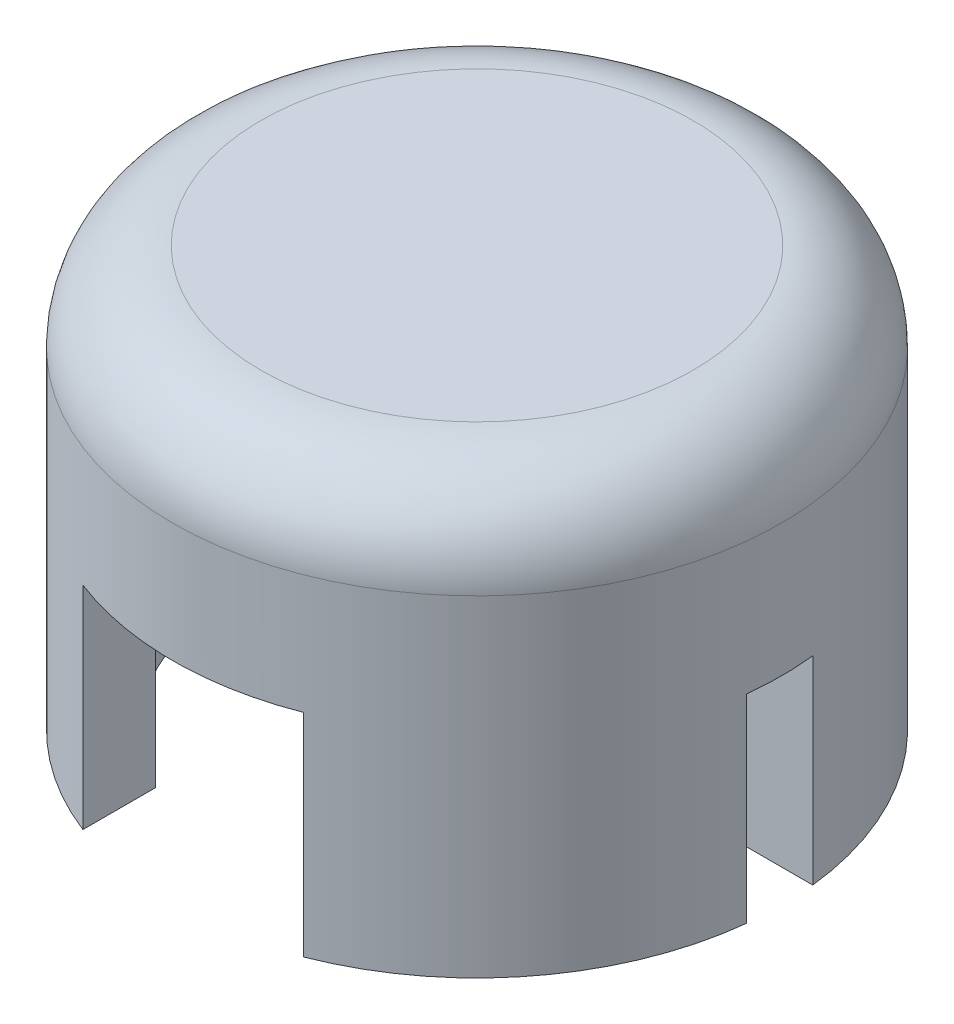
ISO-10303-21;
HEADER;
FILE_DESCRIPTION(('STEP AP214'),'2;1');
FILE_NAME('part.step','',(''),(''),'','','');
FILE_SCHEMA(('AUTOMOTIVE_DESIGN { 1 0 10303 214 1 1 1 1 }'));
ENDSEC;
DATA;
#1=APPLICATION_CONTEXT('core data for automotive mechanical design processes');
#2=APPLICATION_PROTOCOL_DEFINITION('international standard','automotive_design',2000,#1);
#3=PRODUCT_CONTEXT('',#1,'mechanical');
#4=PRODUCT('Part','Part','',(#3));
#5=PRODUCT_RELATED_PRODUCT_CATEGORY('part','',(#4));
#6=PRODUCT_DEFINITION_FORMATION('','',#4);
#7=PRODUCT_DEFINITION_CONTEXT('part definition',#1,'design');
#8=PRODUCT_DEFINITION('design','',#6,#7);
#9=PRODUCT_DEFINITION_SHAPE('','',#8);
#10=(LENGTH_UNIT() NAMED_UNIT(*) SI_UNIT(.MILLI.,.METRE.));
#11=(NAMED_UNIT(*) PLANE_ANGLE_UNIT() SI_UNIT($,.RADIAN.));
#12=(NAMED_UNIT(*) SI_UNIT($,.STERADIAN.) SOLID_ANGLE_UNIT());
#13=UNCERTAINTY_MEASURE_WITH_UNIT(LENGTH_MEASURE(1.E-05),#10,'distance_accuracy_value','');
#14=(GEOMETRIC_REPRESENTATION_CONTEXT(3) GLOBAL_UNCERTAINTY_ASSIGNED_CONTEXT((#13)) GLOBAL_UNIT_ASSIGNED_CONTEXT((#10,
#11,#12)) REPRESENTATION_CONTEXT('',''));
#15=CARTESIAN_POINT('',(0.,0.,0.));
#16=DIRECTION('',(0.,0.,1.));
#17=DIRECTION('',(1.,0.,0.));
#18=AXIS2_PLACEMENT_3D('',#15,#16,#17);
#19=CARTESIAN_POINT('',(0.,7.3,0.));
#20=DIRECTION('',(0.,-1.,0.));
#21=DIRECTION('',(0.,0.,-1.));
#22=AXIS2_PLACEMENT_3D('',#19,#20,#21);
#23=CYLINDRICAL_SURFACE('',#22,5.4);
#24=DIRECTION('',(0.,-1.,0.));
#25=VECTOR('',#24,1.);
#26=CARTESIAN_POINT('',(5.34766304099277,7.3,0.75));
#27=LINE('',#26,#25);
#28=CARTESIAN_POINT('',(5.34766304099277,0.,0.75));
#29=VERTEX_POINT('',#28);
#30=CARTESIAN_POINT('',(5.34766304099277,3.8,0.75));
#31=VERTEX_POINT('',#30);
#32=EDGE_CURVE('E207',#29,#31,#27,.F.);
#33=ORIENTED_EDGE('',*,*,#32,.F.);
#34=CARTESIAN_POINT('',(0.,0.,0.));
#35=DIRECTION('',(0.,1.,0.));
#36=DIRECTION('',(0.,0.,1.));
#37=AXIS2_PLACEMENT_3D('',#34,#35,#36);
#38=CIRCLE('',#37,5.4);
#39=CARTESIAN_POINT('',(2.5,0.,4.78643917750973));
#40=VERTEX_POINT('',#39);
#41=EDGE_CURVE('E259',#40,#29,#38,.T.);
#42=ORIENTED_EDGE('',*,*,#41,.F.);
#43=DIRECTION('',(0.,-1.,0.));
#44=VECTOR('',#43,1.);
#45=CARTESIAN_POINT('',(2.5,7.3,4.78643917750973));
#46=LINE('',#45,#44);
#47=CARTESIAN_POINT('',(2.5,3.8,4.78643917750973));
#48=VERTEX_POINT('',#47);
#49=EDGE_CURVE('E240',#40,#48,#46,.F.);
#50=ORIENTED_EDGE('',*,*,#49,.T.);
#51=CARTESIAN_POINT('',(0.,3.8,0.));
#52=DIRECTION('',(0.,1.,0.));
#53=DIRECTION('',(0.,0.,1.));
#54=AXIS2_PLACEMENT_3D('',#51,#52,#53);
#55=CIRCLE('',#54,5.4);
#56=EDGE_CURVE('E258',#48,#31,#55,.T.);
#57=ORIENTED_EDGE('',*,*,#56,.T.);
#58=EDGE_LOOP('',(#33,#42,#50,#57));
#59=FACE_BOUND('',#58,.T.);
#60=ADVANCED_FACE('F37',(#59),#23,.F.);
#61=DIRECTION('',(0.,-1.,0.));
#62=VECTOR('',#61,1.);
#63=CARTESIAN_POINT('',(-5.34766304099277,7.3,0.75));
#64=LINE('',#63,#62);
#65=CARTESIAN_POINT('',(-5.34766304099277,3.8,0.75));
#66=VERTEX_POINT('',#65);
#67=CARTESIAN_POINT('',(-5.34766304099277,0.,0.75));
#68=VERTEX_POINT('',#67);
#69=EDGE_CURVE('E204',#66,#68,#64,.T.);
#70=ORIENTED_EDGE('',*,*,#69,.F.);
#71=CARTESIAN_POINT('',(-2.5,3.8,4.78643917750973));
#72=VERTEX_POINT('',#71);
#73=EDGE_CURVE('E276',#66,#72,#55,.T.);
#74=ORIENTED_EDGE('',*,*,#73,.T.);
#75=DIRECTION('',(0.,-1.,0.));
#76=VECTOR('',#75,1.);
#77=CARTESIAN_POINT('',(-2.5,7.3,4.78643917750973));
#78=LINE('',#77,#76);
#79=CARTESIAN_POINT('',(-2.5,0.,4.78643917750973));
#80=VERTEX_POINT('',#79);
#81=EDGE_CURVE('E232',#72,#80,#78,.T.);
#82=ORIENTED_EDGE('',*,*,#81,.T.);
#83=EDGE_CURVE('E257',#68,#80,#38,.T.);
#84=ORIENTED_EDGE('',*,*,#83,.F.);
#85=EDGE_LOOP('',(#70,#74,#82,#84));
#86=FACE_BOUND('',#85,.T.);
#87=ADVANCED_FACE('F331',(#86),#23,.F.);
#88=CARTESIAN_POINT('',(0.,0.,0.));
#89=DIRECTION('',(0.,1.,0.));
#90=DIRECTION('',(0.,0.,1.));
#91=AXIS2_PLACEMENT_3D('',#88,#89,#90);
#92=PLANE('',#91);
#93=ORIENTED_EDGE('',*,*,#41,.T.);
#94=DIRECTION('',(1.,0.,0.));
#95=VECTOR('',#94,1.);
#96=CARTESIAN_POINT('',(-6.9,0.,0.75));
#97=LINE('',#96,#95);
#98=CARTESIAN_POINT('',(6.8591180191042,0.,0.75));
#99=VERTEX_POINT('',#98);
#100=EDGE_CURVE('E314',#29,#99,#97,.T.);
#101=ORIENTED_EDGE('',*,*,#100,.T.);
#102=CARTESIAN_POINT('',(0.,0.,0.));
#103=DIRECTION('',(0.,1.,0.));
#104=DIRECTION('',(0.,0.,1.));
#105=AXIS2_PLACEMENT_3D('',#102,#103,#104);
#106=CIRCLE('',#105,6.9);
#107=CARTESIAN_POINT('',(2.5,0.,6.43117407632541));
#108=VERTEX_POINT('',#107);
#109=EDGE_CURVE('E264',#108,#99,#106,.T.);
#110=ORIENTED_EDGE('',*,*,#109,.F.);
#111=DIRECTION('',(0.,0.,-1.));
#112=VECTOR('',#111,1.);
#113=CARTESIAN_POINT('',(2.5,0.,6.9));
#114=LINE('',#113,#112);
#115=EDGE_CURVE('E214',#108,#40,#114,.T.);
#116=ORIENTED_EDGE('',*,*,#115,.T.);
#117=EDGE_LOOP('',(#93,#101,#110,#116));
#118=FACE_BOUND('',#117,.T.);
#119=ADVANCED_FACE('F362',(#118),#92,.F.);
#120=CARTESIAN_POINT('',(-6.8591180191042,0.,0.75));
#121=VERTEX_POINT('',#120);
#122=CARTESIAN_POINT('',(-2.5,0.,6.43117407632541));
#123=VERTEX_POINT('',#122);
#124=EDGE_CURVE('E262',#121,#123,#106,.T.);
#125=ORIENTED_EDGE('',*,*,#124,.F.);
#126=EDGE_CURVE('E313',#121,#68,#97,.T.);
#127=ORIENTED_EDGE('',*,*,#126,.T.);
#128=ORIENTED_EDGE('',*,*,#83,.T.);
#129=DIRECTION('',(0.,0.,-1.));
#130=VECTOR('',#129,1.);
#131=CARTESIAN_POINT('',(-2.5,0.,6.9));
#132=LINE('',#131,#130);
#133=EDGE_CURVE('E217',#123,#80,#132,.T.);
#134=ORIENTED_EDGE('',*,*,#133,.F.);
#135=EDGE_LOOP('',(#125,#127,#128,#134));
#136=FACE_BOUND('',#135,.T.);
#137=ADVANCED_FACE('F383',(#136),#92,.F.);
#138=CARTESIAN_POINT('',(5.5,3.8,0.));
#139=DIRECTION('',(0.,1.,0.));
#140=DIRECTION('',(0.,0.,1.));
#141=AXIS2_PLACEMENT_3D('',#138,#139,#140);
#142=PLANE('',#141);
#143=CARTESIAN_POINT('',(0.,3.8,0.));
#144=DIRECTION('',(0.,1.,0.));
#145=DIRECTION('',(0.,0.,1.));
#146=AXIS2_PLACEMENT_3D('',#143,#144,#145);
#147=CIRCLE('',#146,4.4);
#148=CARTESIAN_POINT('',(2.5,3.8,3.62077339804633));
#149=VERTEX_POINT('',#148);
#150=CARTESIAN_POINT('',(4.33560837714847,3.8,0.75));
#151=VERTEX_POINT('',#150);
#152=EDGE_CURVE('E249',#149,#151,#147,.T.);
#153=ORIENTED_EDGE('',*,*,#152,.T.);
#154=DIRECTION('',(1.,0.,0.));
#155=VECTOR('',#154,1.);
#156=CARTESIAN_POINT('',(5.5,3.8,0.75));
#157=LINE('',#156,#155);
#158=EDGE_CURVE('E205',#151,#31,#157,.T.);
#159=ORIENTED_EDGE('',*,*,#158,.T.);
#160=ORIENTED_EDGE('',*,*,#56,.F.);
#161=DIRECTION('',(0.,0.,1.));
#162=VECTOR('',#161,1.);
#163=CARTESIAN_POINT('',(2.5,3.8,0.));
#164=LINE('',#163,#162);
#165=EDGE_CURVE('E238',#149,#48,#164,.T.);
#166=ORIENTED_EDGE('',*,*,#165,.F.);
#167=EDGE_LOOP('',(#153,#159,#160,#166));
#168=FACE_BOUND('',#167,.T.);
#169=ADVANCED_FACE('F372',(#168),#142,.F.);
#170=ORIENTED_EDGE('',*,*,#73,.F.);
#171=CARTESIAN_POINT('',(-4.33560837714847,3.8,0.75));
#172=VERTEX_POINT('',#171);
#173=EDGE_CURVE('E201',#66,#172,#157,.T.);
#174=ORIENTED_EDGE('',*,*,#173,.T.);
#175=CARTESIAN_POINT('',(-2.5,3.8,3.62077339804633));
#176=VERTEX_POINT('',#175);
#177=EDGE_CURVE('E248',#172,#176,#147,.T.);
#178=ORIENTED_EDGE('',*,*,#177,.T.);
#179=DIRECTION('',(0.,0.,-1.));
#180=VECTOR('',#179,1.);
#181=CARTESIAN_POINT('',(-2.5,3.8,0.));
#182=LINE('',#181,#180);
#183=EDGE_CURVE('E229',#72,#176,#182,.T.);
#184=ORIENTED_EDGE('',*,*,#183,.F.);
#185=EDGE_LOOP('',(#170,#174,#178,#184));
#186=FACE_BOUND('',#185,.T.);
#187=ADVANCED_FACE('F339',(#186),#142,.F.);
#188=DIRECTION('',(0.,-1.,0.));
#189=VECTOR('',#188,1.);
#190=CARTESIAN_POINT('',(5.34766304099277,7.3,-0.75));
#191=LINE('',#190,#189);
#192=CARTESIAN_POINT('',(5.34766304099277,3.8,-0.75));
#193=VERTEX_POINT('',#192);
#194=CARTESIAN_POINT('',(5.34766304099277,0.,-0.75));
#195=VERTEX_POINT('',#194);
#196=EDGE_CURVE('E304',#193,#195,#191,.T.);
#197=ORIENTED_EDGE('',*,*,#196,.F.);
#198=CARTESIAN_POINT('',(-5.34766304099277,3.8,-0.75));
#199=VERTEX_POINT('',#198);
#200=EDGE_CURVE('E279',#193,#199,#55,.T.);
#201=ORIENTED_EDGE('',*,*,#200,.T.);
#202=DIRECTION('',(0.,-1.,0.));
#203=VECTOR('',#202,1.);
#204=CARTESIAN_POINT('',(-5.34766304099277,7.3,-0.75));
#205=LINE('',#204,#203);
#206=CARTESIAN_POINT('',(-5.34766304099277,0.,-0.75));
#207=VERTEX_POINT('',#206);
#208=EDGE_CURVE('E195',#207,#199,#205,.F.);
#209=ORIENTED_EDGE('',*,*,#208,.F.);
#210=EDGE_CURVE('E263',#195,#207,#38,.T.);
#211=ORIENTED_EDGE('',*,*,#210,.F.);
#212=EDGE_LOOP('',(#197,#201,#209,#211));
#213=FACE_BOUND('',#212,.T.);
#214=ADVANCED_FACE('F324',(#213),#23,.F.);
#215=CARTESIAN_POINT('',(6.8591180191042,0.,-0.75));
#216=VERTEX_POINT('',#215);
#217=CARTESIAN_POINT('',(-6.8591180191042,0.,-0.75));
#218=VERTEX_POINT('',#217);
#219=EDGE_CURVE('E194',#216,#218,#106,.T.);
#220=ORIENTED_EDGE('',*,*,#219,.F.);
#221=DIRECTION('',(1.,0.,0.));
#222=VECTOR('',#221,1.);
#223=CARTESIAN_POINT('',(-6.9,0.,-0.75));
#224=LINE('',#223,#222);
#225=EDGE_CURVE('E311',#195,#216,#224,.T.);
#226=ORIENTED_EDGE('',*,*,#225,.F.);
#227=ORIENTED_EDGE('',*,*,#210,.T.);
#228=EDGE_CURVE('E310',#218,#207,#224,.T.);
#229=ORIENTED_EDGE('',*,*,#228,.F.);
#230=EDGE_LOOP('',(#220,#226,#227,#229));
#231=FACE_BOUND('',#230,.T.);
#232=ADVANCED_FACE('F379',(#231),#92,.F.);
#233=CARTESIAN_POINT('',(0.,7.3,0.));
#234=DIRECTION('',(0.,-1.,0.));
#235=DIRECTION('',(0.,0.,-1.));
#236=AXIS2_PLACEMENT_3D('',#233,#234,#235);
#237=CYLINDRICAL_SURFACE('',#236,6.9);
#238=CARTESIAN_POINT('',(0.,7.5,0.));
#239=DIRECTION('',(0.,1.,0.));
#240=DIRECTION('',(0.,0.,1.));
#241=AXIS2_PLACEMENT_3D('',#238,#239,#240);
#242=CIRCLE('',#241,6.9);
#243=CARTESIAN_POINT('',(0.,7.5,6.9));
#244=VERTEX_POINT('',#243);
#245=EDGE_CURVE('E269',#244,#244,#242,.F.);
#246=ORIENTED_EDGE('',*,*,#245,.T.);
#247=EDGE_LOOP('',(#246));
#248=FACE_BOUND('',#247,.T.);
#249=ORIENTED_EDGE('',*,*,#109,.T.);
#250=DIRECTION('',(0.,-1.,0.));
#251=VECTOR('',#250,1.);
#252=CARTESIAN_POINT('',(6.8591180191042,7.3,0.75));
#253=LINE('',#252,#251);
#254=CARTESIAN_POINT('',(6.8591180191042,4.5,0.75));
#255=VERTEX_POINT('',#254);
#256=EDGE_CURVE('E209',#99,#255,#253,.F.);
#257=ORIENTED_EDGE('',*,*,#256,.T.);
#258=CARTESIAN_POINT('',(0.,4.5,0.));
#259=DIRECTION('',(0.,1.,0.));
#260=DIRECTION('',(0.,0.,1.));
#261=AXIS2_PLACEMENT_3D('',#258,#259,#260);
#262=CIRCLE('',#261,6.9);
#263=CARTESIAN_POINT('',(6.8591180191042,4.5,-0.75));
#264=VERTEX_POINT('',#263);
#265=EDGE_CURVE('E180',#255,#264,#262,.T.);
#266=ORIENTED_EDGE('',*,*,#265,.T.);
#267=DIRECTION('',(0.,-1.,0.));
#268=VECTOR('',#267,1.);
#269=CARTESIAN_POINT('',(6.8591180191042,7.3,-0.75));
#270=LINE('',#269,#268);
#271=EDGE_CURVE('E181',#264,#216,#270,.T.);
#272=ORIENTED_EDGE('',*,*,#271,.T.);
#273=ORIENTED_EDGE('',*,*,#219,.T.);
#274=DIRECTION('',(0.,-1.,0.));
#275=VECTOR('',#274,1.);
#276=CARTESIAN_POINT('',(-6.8591180191042,7.3,-0.75));
#277=LINE('',#276,#275);
#278=CARTESIAN_POINT('',(-6.8591180191042,4.5,-0.75));
#279=VERTEX_POINT('',#278);
#280=EDGE_CURVE('E184',#218,#279,#277,.F.);
#281=ORIENTED_EDGE('',*,*,#280,.T.);
#282=CARTESIAN_POINT('',(-6.8591180191042,4.5,0.75));
#283=VERTEX_POINT('',#282);
#284=EDGE_CURVE('E169',#279,#283,#262,.T.);
#285=ORIENTED_EDGE('',*,*,#284,.T.);
#286=DIRECTION('',(0.,-1.,0.));
#287=VECTOR('',#286,1.);
#288=CARTESIAN_POINT('',(-6.8591180191042,7.3,0.75));
#289=LINE('',#288,#287);
#290=EDGE_CURVE('E212',#283,#121,#289,.T.);
#291=ORIENTED_EDGE('',*,*,#290,.T.);
#292=ORIENTED_EDGE('',*,*,#124,.T.);
#293=DIRECTION('',(0.,-1.,0.));
#294=VECTOR('',#293,1.);
#295=CARTESIAN_POINT('',(-2.5,7.3,6.43117407632541));
#296=LINE('',#295,#294);
#297=CARTESIAN_POINT('',(-2.5,4.8,6.43117407632541));
#298=VERTEX_POINT('',#297);
#299=EDGE_CURVE('E235',#298,#123,#296,.T.);
#300=ORIENTED_EDGE('',*,*,#299,.F.);
#301=CARTESIAN_POINT('',(0.,4.8,0.));
#302=DIRECTION('',(0.,-1.,0.));
#303=DIRECTION('',(1.,0.,0.));
#304=AXIS2_PLACEMENT_3D('',#301,#302,#303);
#305=CIRCLE('',#304,6.9);
#306=CARTESIAN_POINT('',(2.5,4.8,6.43117407632541));
#307=VERTEX_POINT('',#306);
#308=EDGE_CURVE('E227',#307,#298,#305,.T.);
#309=ORIENTED_EDGE('',*,*,#308,.F.);
#310=DIRECTION('',(0.,-1.,0.));
#311=VECTOR('',#310,1.);
#312=CARTESIAN_POINT('',(2.5,7.3,6.43117407632541));
#313=LINE('',#312,#311);
#314=EDGE_CURVE('E243',#108,#307,#313,.F.);
#315=ORIENTED_EDGE('',*,*,#314,.F.);
#316=EDGE_LOOP('',(#249,#257,#266,#272,#273,#281,#285,#291,#292,#300,#309,#315));
#317=FACE_BOUND('',#316,.T.);
#318=ADVANCED_FACE('F191',(#248,#317),#237,.T.);
#319=ORIENTED_EDGE('',*,*,#200,.F.);
#320=DIRECTION('',(-1.,0.,0.));
#321=VECTOR('',#320,1.);
#322=CARTESIAN_POINT('',(5.5,3.8,-0.75));
#323=LINE('',#322,#321);
#324=CARTESIAN_POINT('',(4.33560837714847,3.8,-0.75));
#325=VERTEX_POINT('',#324);
#326=EDGE_CURVE('E301',#193,#325,#323,.T.);
#327=ORIENTED_EDGE('',*,*,#326,.T.);
#328=CARTESIAN_POINT('',(-4.33560837714847,3.8,-0.75));
#329=VERTEX_POINT('',#328);
#330=EDGE_CURVE('E253',#325,#329,#147,.T.);
#331=ORIENTED_EDGE('',*,*,#330,.T.);
#332=EDGE_CURVE('E60',#329,#199,#323,.T.);
#333=ORIENTED_EDGE('',*,*,#332,.T.);
#334=EDGE_LOOP('',(#319,#327,#331,#333));
#335=FACE_BOUND('',#334,.T.);
#336=ADVANCED_FACE('F321',(#335),#142,.F.);
#337=CARTESIAN_POINT('',(5.5,4.8,0.));
#338=DIRECTION('',(0.,-1.,0.));
#339=DIRECTION('',(0.,0.,-1.));
#340=AXIS2_PLACEMENT_3D('',#337,#338,#339);
#341=PLANE('',#340);
#342=DIRECTION('',(0.,0.,-1.));
#343=VECTOR('',#342,1.);
#344=CARTESIAN_POINT('',(2.5,4.8,6.9));
#345=LINE('',#344,#343);
#346=CARTESIAN_POINT('',(2.5,4.8,4.78643917750973));
#347=VERTEX_POINT('',#346);
#348=CARTESIAN_POINT('',(2.5,4.8,3.62077339804633));
#349=VERTEX_POINT('',#348);
#350=EDGE_CURVE('E224',#347,#349,#345,.T.);
#351=ORIENTED_EDGE('',*,*,#350,.F.);
#352=CARTESIAN_POINT('',(0.,4.8,0.));
#353=DIRECTION('',(0.,-1.,0.));
#354=DIRECTION('',(0.,0.,-1.));
#355=AXIS2_PLACEMENT_3D('',#352,#353,#354);
#356=CIRCLE('',#355,5.4);
#357=CARTESIAN_POINT('',(-2.5,4.8,4.78643917750973));
#358=VERTEX_POINT('',#357);
#359=EDGE_CURVE('E252',#358,#347,#356,.T.);
#360=ORIENTED_EDGE('',*,*,#359,.F.);
#361=DIRECTION('',(0.,0.,-1.));
#362=VECTOR('',#361,1.);
#363=CARTESIAN_POINT('',(-2.5,4.8,6.9));
#364=LINE('',#363,#362);
#365=CARTESIAN_POINT('',(-2.5,4.8,3.62077339804633));
#366=VERTEX_POINT('',#365);
#367=EDGE_CURVE('E220',#358,#366,#364,.T.);
#368=ORIENTED_EDGE('',*,*,#367,.T.);
#369=CARTESIAN_POINT('',(0.,4.8,0.));
#370=DIRECTION('',(0.,1.,0.));
#371=DIRECTION('',(0.,0.,1.));
#372=AXIS2_PLACEMENT_3D('',#369,#370,#371);
#373=CIRCLE('',#372,4.4);
#374=EDGE_CURVE('E245',#349,#366,#373,.T.);
#375=ORIENTED_EDGE('',*,*,#374,.F.);
#376=EDGE_LOOP('',(#351,#360,#368,#375));
#377=FACE_BOUND('',#376,.T.);
#378=ADVANCED_FACE('F347',(#377),#341,.F.);
#379=CARTESIAN_POINT('',(0.,9.975,0.));
#380=DIRECTION('',(0.,1.,0.));
#381=DIRECTION('',(0.,0.,1.));
#382=AXIS2_PLACEMENT_3D('',#379,#380,#381);
#383=CYLINDRICAL_SURFACE('',#382,4.4);
#384=ORIENTED_EDGE('',*,*,#177,.F.);
#385=DIRECTION('',(0.,1.,0.));
#386=VECTOR('',#385,1.);
#387=CARTESIAN_POINT('',(-4.33560837714847,9.975,0.75));
#388=LINE('',#387,#386);
#389=CARTESIAN_POINT('',(-4.33560837714847,4.5,0.75));
#390=VERTEX_POINT('',#389);
#391=EDGE_CURVE('E45',#172,#390,#388,.T.);
#392=ORIENTED_EDGE('',*,*,#391,.T.);
#393=CARTESIAN_POINT('',(0.,4.5,0.));
#394=DIRECTION('',(0.,1.,0.));
#395=DIRECTION('',(0.,0.,1.));
#396=AXIS2_PLACEMENT_3D('',#393,#394,#395);
#397=CIRCLE('',#396,4.4);
#398=CARTESIAN_POINT('',(-4.33560837714847,4.5,-0.75));
#399=VERTEX_POINT('',#398);
#400=EDGE_CURVE('E290',#390,#399,#397,.F.);
#401=ORIENTED_EDGE('',*,*,#400,.T.);
#402=DIRECTION('',(0.,1.,0.));
#403=VECTOR('',#402,1.);
#404=CARTESIAN_POINT('',(-4.33560837714847,9.975,-0.75));
#405=LINE('',#404,#403);
#406=EDGE_CURVE('E186',#399,#329,#405,.F.);
#407=ORIENTED_EDGE('',*,*,#406,.T.);
#408=ORIENTED_EDGE('',*,*,#330,.F.);
#409=DIRECTION('',(0.,1.,0.));
#410=VECTOR('',#409,1.);
#411=CARTESIAN_POINT('',(4.33560837714847,9.975,-0.75));
#412=LINE('',#411,#410);
#413=CARTESIAN_POINT('',(4.33560837714847,4.5,-0.75));
#414=VERTEX_POINT('',#413);
#415=EDGE_CURVE('E283',#325,#414,#412,.T.);
#416=ORIENTED_EDGE('',*,*,#415,.T.);
#417=CARTESIAN_POINT('',(4.33560837714847,4.5,0.75));
#418=VERTEX_POINT('',#417);
#419=EDGE_CURVE('E286',#414,#418,#397,.F.);
#420=ORIENTED_EDGE('',*,*,#419,.T.);
#421=DIRECTION('',(0.,1.,0.));
#422=VECTOR('',#421,1.);
#423=CARTESIAN_POINT('',(4.33560837714847,9.975,0.75));
#424=LINE('',#423,#422);
#425=EDGE_CURVE('E289',#418,#151,#424,.F.);
#426=ORIENTED_EDGE('',*,*,#425,.T.);
#427=ORIENTED_EDGE('',*,*,#152,.F.);
#428=DIRECTION('',(0.,1.,0.));
#429=VECTOR('',#428,1.);
#430=CARTESIAN_POINT('',(2.5,9.975,3.62077339804633));
#431=LINE('',#430,#429);
#432=EDGE_CURVE('E281',#349,#149,#431,.F.);
#433=ORIENTED_EDGE('',*,*,#432,.F.);
#434=ORIENTED_EDGE('',*,*,#374,.T.);
#435=DIRECTION('',(0.,1.,0.));
#436=VECTOR('',#435,1.);
#437=CARTESIAN_POINT('',(-2.5,9.975,3.62077339804633));
#438=LINE('',#437,#436);
#439=EDGE_CURVE('E272',#176,#366,#438,.T.);
#440=ORIENTED_EDGE('',*,*,#439,.F.);
#441=EDGE_LOOP('',(#384,#392,#401,#407,#408,#416,#420,#426,#427,#433,#434,#440));
#442=FACE_BOUND('',#441,.T.);
#443=ADVANCED_FACE('F296',(#442),#383,.F.);
#444=CARTESIAN_POINT('',(0.,9.5,0.));
#445=DIRECTION('',(0.,1.,0.));
#446=DIRECTION('',(0.,0.,1.));
#447=AXIS2_PLACEMENT_3D('',#444,#445,#446);
#448=PLANE('',#447);
#449=CARTESIAN_POINT('',(0.,9.5,0.));
#450=DIRECTION('',(0.,1.,0.));
#451=DIRECTION('',(0.,0.,1.));
#452=AXIS2_PLACEMENT_3D('',#449,#450,#451);
#453=CIRCLE('',#452,4.9);
#454=CARTESIAN_POINT('',(0.,9.5,4.9));
#455=VERTEX_POINT('',#454);
#456=EDGE_CURVE('E266',#455,#455,#453,.T.);
#457=ORIENTED_EDGE('',*,*,#456,.T.);
#458=EDGE_LOOP('',(#457));
#459=FACE_BOUND('',#458,.T.);
#460=ADVANCED_FACE('F416',(#459),#448,.T.);
#461=CARTESIAN_POINT('',(0.,7.5,0.));
#462=DIRECTION('',(0.,1.,0.));
#463=DIRECTION('',(0.,0.,1.));
#464=AXIS2_PLACEMENT_3D('',#461,#462,#463);
#465=TOROIDAL_SURFACE('',#464,4.9,2.);
#466=ORIENTED_EDGE('',*,*,#245,.F.);
#467=EDGE_LOOP('',(#466));
#468=FACE_BOUND('',#467,.T.);
#469=ORIENTED_EDGE('',*,*,#456,.F.);
#470=EDGE_LOOP('',(#469));
#471=FACE_BOUND('',#470,.T.);
#472=ADVANCED_FACE('F39',(#468,#471),#465,.T.);
#473=CARTESIAN_POINT('',(0.,7.3,0.));
#474=DIRECTION('',(0.,1.,0.));
#475=DIRECTION('',(0.,0.,1.));
#476=AXIS2_PLACEMENT_3D('',#473,#474,#475);
#477=PLANE('',#476);
#478=CARTESIAN_POINT('',(0.,7.3,0.));
#479=DIRECTION('',(0.,1.,0.));
#480=DIRECTION('',(0.,0.,1.));
#481=AXIS2_PLACEMENT_3D('',#478,#479,#480);
#482=CIRCLE('',#481,3.);
#483=CARTESIAN_POINT('',(0.,7.3,3.));
#484=VERTEX_POINT('',#483);
#485=EDGE_CURVE('E11',#484,#484,#482,.F.);
#486=ORIENTED_EDGE('',*,*,#485,.F.);
#487=EDGE_LOOP('',(#486));
#488=FACE_BOUND('',#487,.T.);
#489=CARTESIAN_POINT('',(0.,7.3,0.));
#490=DIRECTION('',(0.,1.,0.));
#491=DIRECTION('',(0.,0.,1.));
#492=AXIS2_PLACEMENT_3D('',#489,#490,#491);
#493=CIRCLE('',#492,5.4);
#494=CARTESIAN_POINT('',(0.,7.3,5.4));
#495=VERTEX_POINT('',#494);
#496=EDGE_CURVE('E254',#495,#495,#493,.T.);
#497=ORIENTED_EDGE('',*,*,#496,.F.);
#498=EDGE_LOOP('',(#497));
#499=FACE_BOUND('',#498,.T.);
#500=ADVANCED_FACE('F403',(#488,#499),#477,.F.);
#501=ORIENTED_EDGE('',*,*,#496,.T.);
#502=EDGE_LOOP('',(#501));
#503=FACE_BOUND('',#502,.T.);
#504=EDGE_CURVE('E273',#347,#358,#356,.T.);
#505=ORIENTED_EDGE('',*,*,#504,.T.);
#506=ORIENTED_EDGE('',*,*,#359,.T.);
#507=EDGE_LOOP('',(#505,#506));
#508=FACE_BOUND('',#507,.T.);
#509=ADVANCED_FACE('F350',(#503,#508),#23,.F.);
#510=CARTESIAN_POINT('',(2.5,0.,6.9));
#511=DIRECTION('',(-1.,0.,0.));
#512=DIRECTION('',(0.,0.,1.));
#513=AXIS2_PLACEMENT_3D('',#510,#511,#512);
#514=PLANE('',#513);
#515=ORIENTED_EDGE('',*,*,#314,.T.);
#516=EDGE_CURVE('E226',#307,#347,#345,.T.);
#517=ORIENTED_EDGE('',*,*,#516,.T.);
#518=ORIENTED_EDGE('',*,*,#350,.T.);
#519=ORIENTED_EDGE('',*,*,#432,.T.);
#520=ORIENTED_EDGE('',*,*,#165,.T.);
#521=ORIENTED_EDGE('',*,*,#49,.F.);
#522=ORIENTED_EDGE('',*,*,#115,.F.);
#523=EDGE_LOOP('',(#515,#517,#518,#519,#520,#521,#522));
#524=FACE_BOUND('',#523,.T.);
#525=ADVANCED_FACE('F357',(#524),#514,.T.);
#526=CARTESIAN_POINT('',(-2.5,0.,6.9));
#527=DIRECTION('',(1.,0.,0.));
#528=DIRECTION('',(0.,1.,0.));
#529=AXIS2_PLACEMENT_3D('',#526,#527,#528);
#530=PLANE('',#529);
#531=ORIENTED_EDGE('',*,*,#299,.T.);
#532=ORIENTED_EDGE('',*,*,#133,.T.);
#533=ORIENTED_EDGE('',*,*,#81,.F.);
#534=ORIENTED_EDGE('',*,*,#183,.T.);
#535=ORIENTED_EDGE('',*,*,#439,.T.);
#536=ORIENTED_EDGE('',*,*,#367,.F.);
#537=EDGE_CURVE('E223',#298,#358,#364,.T.);
#538=ORIENTED_EDGE('',*,*,#537,.F.);
#539=EDGE_LOOP('',(#531,#532,#533,#534,#535,#536,#538));
#540=FACE_BOUND('',#539,.T.);
#541=ADVANCED_FACE('F336',(#540),#530,.T.);
#542=CARTESIAN_POINT('',(2.5,4.8,6.9));
#543=DIRECTION('',(0.,-1.,0.));
#544=DIRECTION('',(1.,0.,0.));
#545=AXIS2_PLACEMENT_3D('',#542,#543,#544);
#546=PLANE('',#545);
#547=ORIENTED_EDGE('',*,*,#308,.T.);
#548=ORIENTED_EDGE('',*,*,#537,.T.);
#549=ORIENTED_EDGE('',*,*,#504,.F.);
#550=ORIENTED_EDGE('',*,*,#516,.F.);
#551=EDGE_LOOP('',(#547,#548,#549,#550));
#552=FACE_BOUND('',#551,.T.);
#553=ADVANCED_FACE('F354',(#552),#546,.T.);
#554=CARTESIAN_POINT('',(-6.9,0.,-0.75));
#555=DIRECTION('',(0.,0.,-1.));
#556=DIRECTION('',(-1.,0.,0.));
#557=AXIS2_PLACEMENT_3D('',#554,#555,#556);
#558=PLANE('',#557);
#559=DIRECTION('',(1.,0.,0.));
#560=VECTOR('',#559,1.);
#561=CARTESIAN_POINT('',(-6.9,4.5,-0.75));
#562=LINE('',#561,#560);
#563=EDGE_CURVE('E52',#414,#264,#562,.T.);
#564=ORIENTED_EDGE('',*,*,#563,.F.);
#565=ORIENTED_EDGE('',*,*,#415,.F.);
#566=ORIENTED_EDGE('',*,*,#326,.F.);
#567=ORIENTED_EDGE('',*,*,#196,.T.);
#568=ORIENTED_EDGE('',*,*,#225,.T.);
#569=ORIENTED_EDGE('',*,*,#271,.F.);
#570=EDGE_LOOP('',(#564,#565,#566,#567,#568,#569));
#571=FACE_BOUND('',#570,.T.);
#572=ADVANCED_FACE('F377',(#571),#558,.F.);
#573=CARTESIAN_POINT('',(-6.9,4.5,0.75));
#574=DIRECTION('',(0.,1.,0.));
#575=DIRECTION('',(0.,0.,1.));
#576=AXIS2_PLACEMENT_3D('',#573,#574,#575);
#577=PLANE('',#576);
#578=DIRECTION('',(1.,0.,0.));
#579=VECTOR('',#578,1.);
#580=CARTESIAN_POINT('',(-6.9,4.5,0.75));
#581=LINE('',#580,#579);
#582=EDGE_CURVE('E187',#418,#255,#581,.T.);
#583=ORIENTED_EDGE('',*,*,#582,.F.);
#584=ORIENTED_EDGE('',*,*,#419,.F.);
#585=ORIENTED_EDGE('',*,*,#563,.T.);
#586=ORIENTED_EDGE('',*,*,#265,.F.);
#587=EDGE_LOOP('',(#583,#584,#585,#586));
#588=FACE_BOUND('',#587,.T.);
#589=ADVANCED_FACE('F376',(#588),#577,.F.);
#590=CARTESIAN_POINT('',(-6.9,0.,0.75));
#591=DIRECTION('',(0.,0.,1.));
#592=DIRECTION('',(1.,0.,0.));
#593=AXIS2_PLACEMENT_3D('',#590,#591,#592);
#594=PLANE('',#593);
#595=ORIENTED_EDGE('',*,*,#100,.F.);
#596=ORIENTED_EDGE('',*,*,#32,.T.);
#597=ORIENTED_EDGE('',*,*,#158,.F.);
#598=ORIENTED_EDGE('',*,*,#425,.F.);
#599=ORIENTED_EDGE('',*,*,#582,.T.);
#600=ORIENTED_EDGE('',*,*,#256,.F.);
#601=EDGE_LOOP('',(#595,#596,#597,#598,#599,#600));
#602=FACE_BOUND('',#601,.T.);
#603=ADVANCED_FACE('F366',(#602),#594,.F.);
#604=EDGE_CURVE('E175',#283,#390,#581,.T.);
#605=ORIENTED_EDGE('',*,*,#604,.T.);
#606=ORIENTED_EDGE('',*,*,#391,.F.);
#607=ORIENTED_EDGE('',*,*,#173,.F.);
#608=ORIENTED_EDGE('',*,*,#69,.T.);
#609=ORIENTED_EDGE('',*,*,#126,.F.);
#610=ORIENTED_EDGE('',*,*,#290,.F.);
#611=EDGE_LOOP('',(#605,#606,#607,#608,#609,#610));
#612=FACE_BOUND('',#611,.T.);
#613=ADVANCED_FACE('F300',(#612),#594,.F.);
#614=EDGE_CURVE('E172',#279,#399,#562,.T.);
#615=ORIENTED_EDGE('',*,*,#614,.T.);
#616=ORIENTED_EDGE('',*,*,#400,.F.);
#617=ORIENTED_EDGE('',*,*,#604,.F.);
#618=ORIENTED_EDGE('',*,*,#284,.F.);
#619=EDGE_LOOP('',(#615,#616,#617,#618));
#620=FACE_BOUND('',#619,.T.);
#621=ADVANCED_FACE('F171',(#620),#577,.F.);
#622=ORIENTED_EDGE('',*,*,#228,.T.);
#623=ORIENTED_EDGE('',*,*,#208,.T.);
#624=ORIENTED_EDGE('',*,*,#332,.F.);
#625=ORIENTED_EDGE('',*,*,#406,.F.);
#626=ORIENTED_EDGE('',*,*,#614,.F.);
#627=ORIENTED_EDGE('',*,*,#280,.F.);
#628=EDGE_LOOP('',(#622,#623,#624,#625,#626,#627));
#629=FACE_BOUND('',#628,.T.);
#630=ADVANCED_FACE('F183',(#629),#558,.F.);
#631=CARTESIAN_POINT('',(0.,4.3,0.));
#632=DIRECTION('',(0.,1.,0.));
#633=DIRECTION('',(0.,0.,1.));
#634=AXIS2_PLACEMENT_3D('',#631,#632,#633);
#635=CYLINDRICAL_SURFACE('',#634,3.);
#636=CARTESIAN_POINT('',(0.,4.3,0.));
#637=DIRECTION('',(0.,-1.,0.));
#638=DIRECTION('',(0.,0.,-1.));
#639=AXIS2_PLACEMENT_3D('',#636,#637,#638);
#640=CIRCLE('',#639,3.);
#641=CARTESIAN_POINT('',(0.,4.3,-3.));
#642=VERTEX_POINT('',#641);
#643=EDGE_CURVE('E308',#642,#642,#640,.T.);
#644=ORIENTED_EDGE('',*,*,#643,.F.);
#645=EDGE_LOOP('',(#644));
#646=FACE_BOUND('',#645,.T.);
#647=ORIENTED_EDGE('',*,*,#485,.T.);
#648=EDGE_LOOP('',(#647));
#649=FACE_BOUND('',#648,.T.);
#650=ADVANCED_FACE('F438',(#646,#649),#635,.T.);
#651=CARTESIAN_POINT('',(0.,4.3,0.));
#652=DIRECTION('',(0.,-1.,0.));
#653=DIRECTION('',(0.,0.,-1.));
#654=AXIS2_PLACEMENT_3D('',#651,#652,#653);
#655=PLANE('',#654);
#656=ORIENTED_EDGE('',*,*,#643,.T.);
#657=EDGE_LOOP('',(#656));
#658=FACE_BOUND('',#657,.T.);
#659=ADVANCED_FACE('F441',(#658),#655,.T.);
#660=CLOSED_SHELL('',(#60,#87,#119,#137,#169,#187,#214,#232,#318,#336,#378,#443,#460,#472,#500,
#509,#525,#541,#553,#572,#589,#603,#613,#621,#630,#650,#659));
#661=MANIFOLD_SOLID_BREP('B2',#660);
#662=ADVANCED_BREP_SHAPE_REPRESENTATION('',(#18,#661),#14);
#663=SHAPE_DEFINITION_REPRESENTATION(#9,#662);
ENDSEC;
END-ISO-10303-21;
